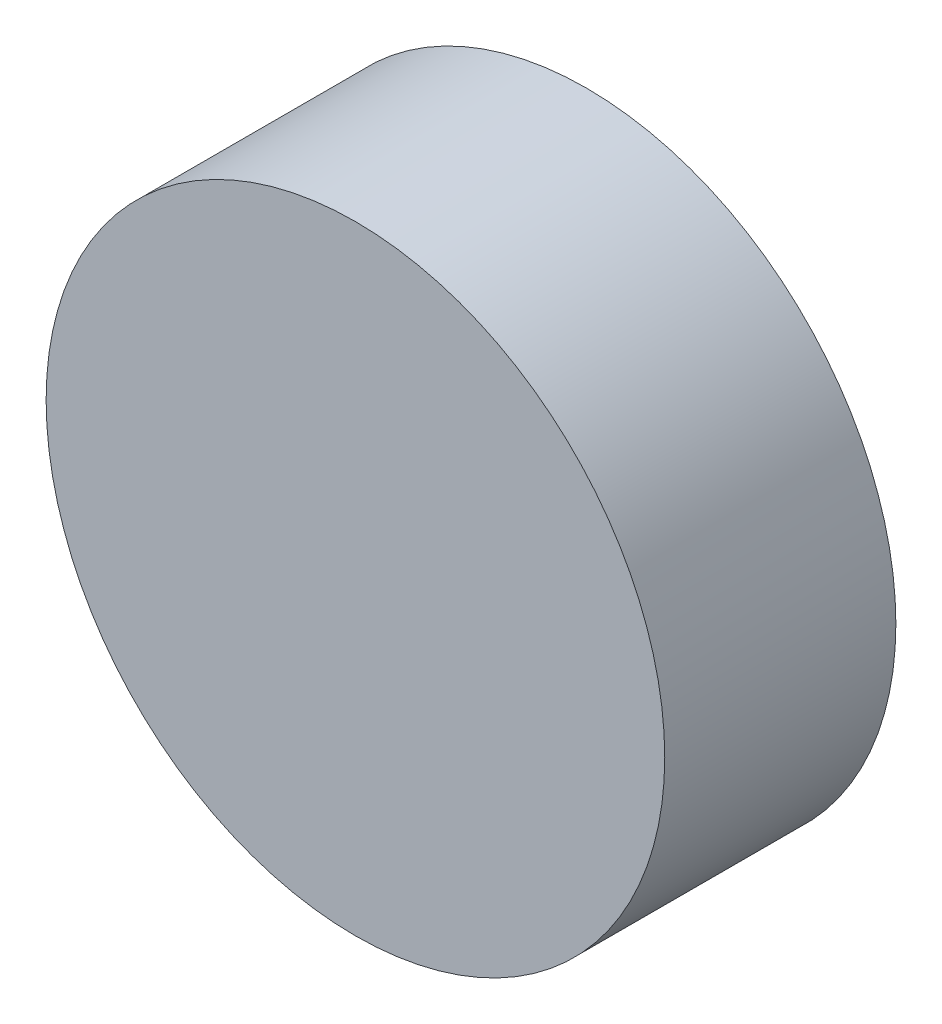
ISO-10303-21;
HEADER;
FILE_DESCRIPTION(('STEP AP214'),'2;1');
FILE_NAME('part.step','',(''),(''),'','','');
FILE_SCHEMA(('AUTOMOTIVE_DESIGN { 1 0 10303 214 1 1 1 1 }'));
ENDSEC;
DATA;
#1=APPLICATION_CONTEXT('core data for automotive mechanical design processes');
#2=APPLICATION_PROTOCOL_DEFINITION('international standard','automotive_design',2000,#1);
#3=PRODUCT_CONTEXT('',#1,'mechanical');
#4=PRODUCT('Part','Part','',(#3));
#5=PRODUCT_RELATED_PRODUCT_CATEGORY('part','',(#4));
#6=PRODUCT_DEFINITION_FORMATION('','',#4);
#7=PRODUCT_DEFINITION_CONTEXT('part definition',#1,'design');
#8=PRODUCT_DEFINITION('design','',#6,#7);
#9=PRODUCT_DEFINITION_SHAPE('','',#8);
#10=(LENGTH_UNIT() NAMED_UNIT(*) SI_UNIT(.MILLI.,.METRE.));
#11=(NAMED_UNIT(*) PLANE_ANGLE_UNIT() SI_UNIT($,.RADIAN.));
#12=(NAMED_UNIT(*) SI_UNIT($,.STERADIAN.) SOLID_ANGLE_UNIT());
#13=UNCERTAINTY_MEASURE_WITH_UNIT(LENGTH_MEASURE(1.E-05),#10,'distance_accuracy_value','');
#14=(GEOMETRIC_REPRESENTATION_CONTEXT(3) GLOBAL_UNCERTAINTY_ASSIGNED_CONTEXT((#13)) GLOBAL_UNIT_ASSIGNED_CONTEXT((#10,
#11,#12)) REPRESENTATION_CONTEXT('',''));
#15=CARTESIAN_POINT('',(0.,0.,0.));
#16=DIRECTION('',(0.,0.,1.));
#17=DIRECTION('',(1.,0.,0.));
#18=AXIS2_PLACEMENT_3D('',#15,#16,#17);
#19=CARTESIAN_POINT('',(0.,0.,6.));
#20=DIRECTION('',(0.,0.,-1.));
#21=DIRECTION('',(-1.,0.,0.));
#22=AXIS2_PLACEMENT_3D('',#19,#20,#21);
#23=CYLINDRICAL_SURFACE('',#22,8.03);
#24=CARTESIAN_POINT('',(0.,0.,6.));
#25=DIRECTION('',(0.,0.,1.));
#26=DIRECTION('',(1.,0.,0.));
#27=AXIS2_PLACEMENT_3D('',#24,#25,#26);
#28=CIRCLE('',#27,8.03);
#29=CARTESIAN_POINT('',(8.03,0.,6.));
#30=VERTEX_POINT('',#29);
#31=EDGE_CURVE('E10',#30,#30,#28,.T.);
#32=ORIENTED_EDGE('',*,*,#31,.F.);
#33=EDGE_LOOP('',(#32));
#34=FACE_BOUND('',#33,.T.);
#35=CARTESIAN_POINT('',(0.,0.,0.));
#36=DIRECTION('',(0.,0.,1.));
#37=DIRECTION('',(1.,0.,0.));
#38=AXIS2_PLACEMENT_3D('',#35,#36,#37);
#39=CIRCLE('',#38,8.03);
#40=CARTESIAN_POINT('',(8.03,0.,0.));
#41=VERTEX_POINT('',#40);
#42=EDGE_CURVE('E40',#41,#41,#39,.T.);
#43=ORIENTED_EDGE('',*,*,#42,.T.);
#44=EDGE_LOOP('',(#43));
#45=FACE_BOUND('',#44,.T.);
#46=ADVANCED_FACE('F37',(#34,#45),#23,.T.);
#47=CARTESIAN_POINT('',(0.,0.,6.));
#48=DIRECTION('',(0.,0.,1.));
#49=DIRECTION('',(1.,0.,0.));
#50=AXIS2_PLACEMENT_3D('',#47,#48,#49);
#51=PLANE('',#50);
#52=ORIENTED_EDGE('',*,*,#31,.T.);
#53=EDGE_LOOP('',(#52));
#54=FACE_BOUND('',#53,.T.);
#55=ADVANCED_FACE('F52',(#54),#51,.T.);
#56=CARTESIAN_POINT('',(0.,0.,0.));
#57=DIRECTION('',(0.,0.,1.));
#58=DIRECTION('',(1.,0.,0.));
#59=AXIS2_PLACEMENT_3D('',#56,#57,#58);
#60=PLANE('',#59);
#61=ORIENTED_EDGE('',*,*,#42,.F.);
#62=EDGE_LOOP('',(#61));
#63=FACE_BOUND('',#62,.T.);
#64=ADVANCED_FACE('F50',(#63),#60,.F.);
#65=CLOSED_SHELL('',(#46,#55,#64));
#66=MANIFOLD_SOLID_BREP('B2',#65);
#67=ADVANCED_BREP_SHAPE_REPRESENTATION('',(#18,#66),#14);
#68=SHAPE_DEFINITION_REPRESENTATION(#9,#67);
ENDSEC;
END-ISO-10303-21;
